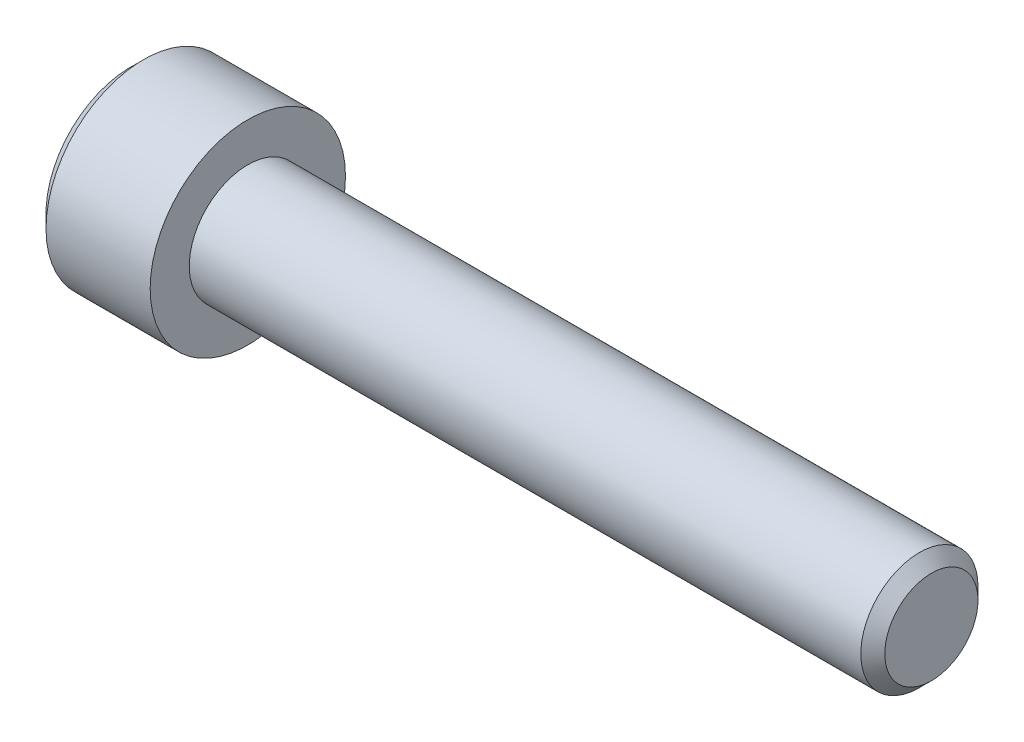
ISO-10303-21;
HEADER;
FILE_DESCRIPTION(('STEP AP214'),'2;1');
FILE_NAME('part.step','',(''),(''),'','','');
FILE_SCHEMA(('AUTOMOTIVE_DESIGN { 1 0 10303 214 1 1 1 1 }'));
ENDSEC;
DATA;
#1=APPLICATION_CONTEXT('core data for automotive mechanical design processes');
#2=APPLICATION_PROTOCOL_DEFINITION('international standard','automotive_design',2000,#1);
#3=PRODUCT_CONTEXT('',#1,'mechanical');
#4=PRODUCT('Part','Part','',(#3));
#5=PRODUCT_RELATED_PRODUCT_CATEGORY('part','',(#4));
#6=PRODUCT_DEFINITION_FORMATION('','',#4);
#7=PRODUCT_DEFINITION_CONTEXT('part definition',#1,'design');
#8=PRODUCT_DEFINITION('design','',#6,#7);
#9=PRODUCT_DEFINITION_SHAPE('','',#8);
#10=(LENGTH_UNIT() NAMED_UNIT(*) SI_UNIT(.MILLI.,.METRE.));
#11=(NAMED_UNIT(*) PLANE_ANGLE_UNIT() SI_UNIT($,.RADIAN.));
#12=(NAMED_UNIT(*) SI_UNIT($,.STERADIAN.) SOLID_ANGLE_UNIT());
#13=UNCERTAINTY_MEASURE_WITH_UNIT(LENGTH_MEASURE(1.E-05),#10,'distance_accuracy_value','');
#14=(GEOMETRIC_REPRESENTATION_CONTEXT(3) GLOBAL_UNCERTAINTY_ASSIGNED_CONTEXT((#13)) GLOBAL_UNIT_ASSIGNED_CONTEXT((#10,
#11,#12)) REPRESENTATION_CONTEXT('',''));
#15=CARTESIAN_POINT('',(0.,0.,0.));
#16=DIRECTION('',(0.,0.,1.));
#17=DIRECTION('',(1.,0.,0.));
#18=AXIS2_PLACEMENT_3D('',#15,#16,#17);
#19=CARTESIAN_POINT('',(-6.,0.,0.));
#20=DIRECTION('',(1.,0.,0.));
#21=DIRECTION('',(0.,0.,-1.));
#22=AXIS2_PLACEMENT_3D('',#19,#20,#21);
#23=PLANE('',#22);
#24=CARTESIAN_POINT('',(-6.,0.,0.));
#25=DIRECTION('',(1.,0.,0.));
#26=DIRECTION('',(0.,0.,-1.));
#27=AXIS2_PLACEMENT_3D('',#24,#25,#26);
#28=CIRCLE('',#27,4.3333333333333);
#29=CARTESIAN_POINT('',(-6.,0.,-4.3333333333333));
#30=VERTEX_POINT('',#29);
#31=EDGE_CURVE('E115',#30,#30,#28,.T.);
#32=ORIENTED_EDGE('',*,*,#31,.F.);
#33=EDGE_LOOP('',(#32));
#34=FACE_BOUND('',#33,.T.);
#35=DIRECTION('',(0.,0.499999999999983,-0.866025403784448));
#36=VECTOR('',#35,1.);
#37=CARTESIAN_POINT('',(-6.,-2.8867513459481,0.));
#38=LINE('',#37,#36);
#39=CARTESIAN_POINT('',(-6.,-2.8867513459481,0.));
#40=VERTEX_POINT('',#39);
#41=CARTESIAN_POINT('',(-6.,-1.4433756729741,-2.5));
#42=VERTEX_POINT('',#41);
#43=EDGE_CURVE('E100',#40,#42,#38,.T.);
#44=ORIENTED_EDGE('',*,*,#43,.T.);
#45=DIRECTION('',(0.,1.,0.));
#46=VECTOR('',#45,1.);
#47=CARTESIAN_POINT('',(-6.,-1.4433756729741,-2.5));
#48=LINE('',#47,#46);
#49=CARTESIAN_POINT('',(-6.,1.4433756729741,-2.5));
#50=VERTEX_POINT('',#49);
#51=EDGE_CURVE('E88',#42,#50,#48,.T.);
#52=ORIENTED_EDGE('',*,*,#51,.T.);
#53=DIRECTION('',(0.,0.499999999999983,0.866025403784448));
#54=VECTOR('',#53,1.);
#55=CARTESIAN_POINT('',(-6.,1.4433756729741,-2.5));
#56=LINE('',#55,#54);
#57=CARTESIAN_POINT('',(-6.,2.8867513459481,0.));
#58=VERTEX_POINT('',#57);
#59=EDGE_CURVE('E99',#50,#58,#56,.T.);
#60=ORIENTED_EDGE('',*,*,#59,.T.);
#61=DIRECTION('',(0.,-0.499999999999983,0.866025403784448));
#62=VECTOR('',#61,1.);
#63=CARTESIAN_POINT('',(-6.,2.8867513459481,0.));
#64=LINE('',#63,#62);
#65=CARTESIAN_POINT('',(-6.,1.4433756729741,2.5));
#66=VERTEX_POINT('',#65);
#67=EDGE_CURVE('E125',#58,#66,#64,.T.);
#68=ORIENTED_EDGE('',*,*,#67,.T.);
#69=DIRECTION('',(0.,-1.,0.));
#70=VECTOR('',#69,1.);
#71=CARTESIAN_POINT('',(-6.,1.4433756729741,2.5));
#72=LINE('',#71,#70);
#73=CARTESIAN_POINT('',(-6.,-1.4433756729741,2.5));
#74=VERTEX_POINT('',#73);
#75=EDGE_CURVE('E130',#66,#74,#72,.T.);
#76=ORIENTED_EDGE('',*,*,#75,.T.);
#77=DIRECTION('',(0.,-0.499999999999983,-0.866025403784448));
#78=VECTOR('',#77,1.);
#79=CARTESIAN_POINT('',(-6.,-1.4433756729741,2.5));
#80=LINE('',#79,#78);
#81=EDGE_CURVE('E114',#74,#40,#80,.T.);
#82=ORIENTED_EDGE('',*,*,#81,.T.);
#83=EDGE_LOOP('',(#44,#52,#60,#68,#76,#82));
#84=FACE_BOUND('',#83,.T.);
#85=ADVANCED_FACE('F16',(#34,#84),#23,.F.);
#86=CARTESIAN_POINT('',(-6.,0.,0.));
#87=DIRECTION('',(1.,0.,0.));
#88=DIRECTION('',(0.,0.,-1.));
#89=AXIS2_PLACEMENT_3D('',#86,#87,#88);
#90=CONICAL_SURFACE('',#89,4.3333333333333,0.78539816339745);
#91=CARTESIAN_POINT('',(-5.3333333333333,0.,0.));
#92=DIRECTION('',(1.,0.,0.));
#93=DIRECTION('',(0.,0.,-1.));
#94=AXIS2_PLACEMENT_3D('',#91,#92,#93);
#95=CIRCLE('',#94,5.);
#96=CARTESIAN_POINT('',(-5.3333333333333,0.,-5.));
#97=VERTEX_POINT('',#96);
#98=EDGE_CURVE('E137',#97,#97,#95,.T.);
#99=ORIENTED_EDGE('',*,*,#98,.F.);
#100=EDGE_LOOP('',(#99));
#101=FACE_BOUND('',#100,.T.);
#102=ORIENTED_EDGE('',*,*,#31,.T.);
#103=EDGE_LOOP('',(#102));
#104=FACE_BOUND('',#103,.T.);
#105=ADVANCED_FACE('F279',(#101,#104),#90,.T.);
#106=CARTESIAN_POINT('',(-3.,-2.8867513459481,0.));
#107=DIRECTION('',(0.,0.866025403784449,0.499999999999983));
#108=DIRECTION('',(0.,-0.499999999999983,0.866025403784449));
#109=AXIS2_PLACEMENT_3D('',#106,#107,#108);
#110=PLANE('',#109);
#111=ORIENTED_EDGE('',*,*,#43,.F.);
#112=DIRECTION('',(-1.,0.,0.));
#113=VECTOR('',#112,1.);
#114=CARTESIAN_POINT('',(-3.,-2.8867513459481,0.));
#115=LINE('',#114,#113);
#116=CARTESIAN_POINT('',(-3.,-2.8867513459481,0.));
#117=VERTEX_POINT('',#116);
#118=EDGE_CURVE('E142',#117,#40,#115,.T.);
#119=ORIENTED_EDGE('',*,*,#118,.F.);
#120=DIRECTION('',(0.,0.499999999999983,-0.866025403784448));
#121=VECTOR('',#120,1.);
#122=CARTESIAN_POINT('',(-3.,-2.8867513459481,0.));
#123=LINE('',#122,#121);
#124=CARTESIAN_POINT('',(-3.,-2.16506350946112,-1.24999999999996));
#125=VERTEX_POINT('',#124);
#126=EDGE_CURVE('E144',#117,#125,#123,.T.);
#127=ORIENTED_EDGE('',*,*,#126,.T.);
#128=DIRECTION('',(0.,0.499999999999983,-0.866025403784448));
#129=VECTOR('',#128,1.);
#130=CARTESIAN_POINT('',(-3.,-2.16506350946112,-1.24999999999996));
#131=LINE('',#130,#129);
#132=CARTESIAN_POINT('',(-3.,-1.4433756729741,-2.5));
#133=VERTEX_POINT('',#132);
#134=EDGE_CURVE('E109',#125,#133,#131,.T.);
#135=ORIENTED_EDGE('',*,*,#134,.T.);
#136=DIRECTION('',(-1.,0.,0.));
#137=VECTOR('',#136,1.);
#138=CARTESIAN_POINT('',(-3.,-1.4433756729741,-2.5));
#139=LINE('',#138,#137);
#140=EDGE_CURVE('E92',#133,#42,#139,.T.);
#141=ORIENTED_EDGE('',*,*,#140,.T.);
#142=EDGE_LOOP('',(#111,#119,#127,#135,#141));
#143=FACE_BOUND('',#142,.T.);
#144=ADVANCED_FACE('F105',(#143),#110,.T.);
#145=CARTESIAN_POINT('',(-3.,-1.4433756729741,-2.5));
#146=DIRECTION('',(0.,0.,1.));
#147=DIRECTION('',(1.,0.,0.));
#148=AXIS2_PLACEMENT_3D('',#145,#146,#147);
#149=PLANE('',#148);
#150=ORIENTED_EDGE('',*,*,#51,.F.);
#151=ORIENTED_EDGE('',*,*,#140,.F.);
#152=DIRECTION('',(0.,1.,0.));
#153=VECTOR('',#152,1.);
#154=CARTESIAN_POINT('',(-3.,-1.4433756729741,-2.5));
#155=LINE('',#154,#153);
#156=CARTESIAN_POINT('',(-3.,0.,-2.5));
#157=VERTEX_POINT('',#156);
#158=EDGE_CURVE('E110',#133,#157,#155,.T.);
#159=ORIENTED_EDGE('',*,*,#158,.T.);
#160=DIRECTION('',(0.,1.,0.));
#161=VECTOR('',#160,1.);
#162=CARTESIAN_POINT('',(-3.,0.,-2.5));
#163=LINE('',#162,#161);
#164=CARTESIAN_POINT('',(-3.,1.4433756729741,-2.5));
#165=VERTEX_POINT('',#164);
#166=EDGE_CURVE('E156',#157,#165,#163,.T.);
#167=ORIENTED_EDGE('',*,*,#166,.T.);
#168=DIRECTION('',(-1.,0.,0.));
#169=VECTOR('',#168,1.);
#170=CARTESIAN_POINT('',(-3.,1.4433756729741,-2.5));
#171=LINE('',#170,#169);
#172=EDGE_CURVE('E95',#165,#50,#171,.T.);
#173=ORIENTED_EDGE('',*,*,#172,.T.);
#174=EDGE_LOOP('',(#150,#151,#159,#167,#173));
#175=FACE_BOUND('',#174,.T.);
#176=ADVANCED_FACE('F90',(#175),#149,.T.);
#177=CARTESIAN_POINT('',(-3.,1.4433756729741,-2.5));
#178=DIRECTION('',(0.,-0.866025403784449,0.499999999999983));
#179=DIRECTION('',(0.,-0.499999999999983,-0.866025403784449));
#180=AXIS2_PLACEMENT_3D('',#177,#178,#179);
#181=PLANE('',#180);
#182=ORIENTED_EDGE('',*,*,#59,.F.);
#183=ORIENTED_EDGE('',*,*,#172,.F.);
#184=DIRECTION('',(0.,0.499999999999983,0.866025403784448));
#185=VECTOR('',#184,1.);
#186=CARTESIAN_POINT('',(-3.,1.4433756729741,-2.5));
#187=LINE('',#186,#185);
#188=CARTESIAN_POINT('',(-3.,2.16506350946112,-1.24999999999996));
#189=VERTEX_POINT('',#188);
#190=EDGE_CURVE('E163',#165,#189,#187,.T.);
#191=ORIENTED_EDGE('',*,*,#190,.T.);
#192=DIRECTION('',(0.,0.499999999999983,0.866025403784448));
#193=VECTOR('',#192,1.);
#194=CARTESIAN_POINT('',(-3.,2.16506350946112,-1.24999999999996));
#195=LINE('',#194,#193);
#196=CARTESIAN_POINT('',(-3.,2.8867513459481,0.));
#197=VERTEX_POINT('',#196);
#198=EDGE_CURVE('E168',#189,#197,#195,.T.);
#199=ORIENTED_EDGE('',*,*,#198,.T.);
#200=DIRECTION('',(-1.,0.,0.));
#201=VECTOR('',#200,1.);
#202=CARTESIAN_POINT('',(-3.,2.8867513459481,0.));
#203=LINE('',#202,#201);
#204=EDGE_CURVE('E173',#197,#58,#203,.T.);
#205=ORIENTED_EDGE('',*,*,#204,.T.);
#206=EDGE_LOOP('',(#182,#183,#191,#199,#205));
#207=FACE_BOUND('',#206,.T.);
#208=ADVANCED_FACE('F295',(#207),#181,.T.);
#209=CARTESIAN_POINT('',(-3.,2.8867513459481,0.));
#210=DIRECTION('',(0.,-0.866025403784449,-0.499999999999983));
#211=DIRECTION('',(0.,0.499999999999983,-0.866025403784449));
#212=AXIS2_PLACEMENT_3D('',#209,#210,#211);
#213=PLANE('',#212);
#214=ORIENTED_EDGE('',*,*,#67,.F.);
#215=ORIENTED_EDGE('',*,*,#204,.F.);
#216=DIRECTION('',(0.,-0.499999999999983,0.866025403784448));
#217=VECTOR('',#216,1.);
#218=CARTESIAN_POINT('',(-3.,2.8867513459481,0.));
#219=LINE('',#218,#217);
#220=CARTESIAN_POINT('',(-3.,2.16506350946112,1.24999999999996));
#221=VERTEX_POINT('',#220);
#222=EDGE_CURVE('E178',#197,#221,#219,.T.);
#223=ORIENTED_EDGE('',*,*,#222,.T.);
#224=DIRECTION('',(0.,-0.499999999999983,0.866025403784448));
#225=VECTOR('',#224,1.);
#226=CARTESIAN_POINT('',(-3.,2.16506350946112,1.24999999999996));
#227=LINE('',#226,#225);
#228=CARTESIAN_POINT('',(-3.,1.4433756729741,2.5));
#229=VERTEX_POINT('',#228);
#230=EDGE_CURVE('E183',#221,#229,#227,.T.);
#231=ORIENTED_EDGE('',*,*,#230,.T.);
#232=DIRECTION('',(-1.,0.,0.));
#233=VECTOR('',#232,1.);
#234=CARTESIAN_POINT('',(-3.,1.4433756729741,2.5));
#235=LINE('',#234,#233);
#236=EDGE_CURVE('E188',#229,#66,#235,.T.);
#237=ORIENTED_EDGE('',*,*,#236,.T.);
#238=EDGE_LOOP('',(#214,#215,#223,#231,#237));
#239=FACE_BOUND('',#238,.T.);
#240=ADVANCED_FACE('F298',(#239),#213,.T.);
#241=CARTESIAN_POINT('',(-3.,1.4433756729741,2.5));
#242=DIRECTION('',(0.,0.,-1.));
#243=DIRECTION('',(-1.,0.,0.));
#244=AXIS2_PLACEMENT_3D('',#241,#242,#243);
#245=PLANE('',#244);
#246=ORIENTED_EDGE('',*,*,#75,.F.);
#247=ORIENTED_EDGE('',*,*,#236,.F.);
#248=DIRECTION('',(0.,-1.,0.));
#249=VECTOR('',#248,1.);
#250=CARTESIAN_POINT('',(-3.,1.4433756729741,2.5));
#251=LINE('',#250,#249);
#252=CARTESIAN_POINT('',(-3.,0.,2.5));
#253=VERTEX_POINT('',#252);
#254=EDGE_CURVE('E193',#229,#253,#251,.T.);
#255=ORIENTED_EDGE('',*,*,#254,.T.);
#256=DIRECTION('',(0.,-1.,0.));
#257=VECTOR('',#256,1.);
#258=CARTESIAN_POINT('',(-3.,0.,2.5));
#259=LINE('',#258,#257);
#260=CARTESIAN_POINT('',(-3.,-1.4433756729741,2.5));
#261=VERTEX_POINT('',#260);
#262=EDGE_CURVE('E198',#253,#261,#259,.T.);
#263=ORIENTED_EDGE('',*,*,#262,.T.);
#264=DIRECTION('',(-1.,0.,0.));
#265=VECTOR('',#264,1.);
#266=CARTESIAN_POINT('',(-3.,-1.4433756729741,2.5));
#267=LINE('',#266,#265);
#268=EDGE_CURVE('E203',#261,#74,#267,.T.);
#269=ORIENTED_EDGE('',*,*,#268,.T.);
#270=EDGE_LOOP('',(#246,#247,#255,#263,#269));
#271=FACE_BOUND('',#270,.T.);
#272=ADVANCED_FACE('F302',(#271),#245,.T.);
#273=CARTESIAN_POINT('',(-3.,-1.4433756729741,2.5));
#274=DIRECTION('',(0.,0.866025403784449,-0.499999999999983));
#275=DIRECTION('',(0.,0.499999999999983,0.866025403784449));
#276=AXIS2_PLACEMENT_3D('',#273,#274,#275);
#277=PLANE('',#276);
#278=ORIENTED_EDGE('',*,*,#81,.F.);
#279=ORIENTED_EDGE('',*,*,#268,.F.);
#280=DIRECTION('',(0.,-0.499999999999983,-0.866025403784448));
#281=VECTOR('',#280,1.);
#282=CARTESIAN_POINT('',(-3.,-1.4433756729741,2.5));
#283=LINE('',#282,#281);
#284=CARTESIAN_POINT('',(-3.,-2.16506350946112,1.24999999999996));
#285=VERTEX_POINT('',#284);
#286=EDGE_CURVE('E208',#261,#285,#283,.T.);
#287=ORIENTED_EDGE('',*,*,#286,.T.);
#288=DIRECTION('',(0.,-0.499999999999983,-0.866025403784448));
#289=VECTOR('',#288,1.);
#290=CARTESIAN_POINT('',(-3.,-2.16506350946112,1.24999999999996));
#291=LINE('',#290,#289);
#292=EDGE_CURVE('E213',#285,#117,#291,.T.);
#293=ORIENTED_EDGE('',*,*,#292,.T.);
#294=ORIENTED_EDGE('',*,*,#118,.T.);
#295=EDGE_LOOP('',(#278,#279,#287,#293,#294));
#296=FACE_BOUND('',#295,.T.);
#297=ADVANCED_FACE('F275',(#296),#277,.T.);
#298=CARTESIAN_POINT('',(35.,0.,0.));
#299=DIRECTION('',(1.,0.,0.));
#300=DIRECTION('',(0.,0.,-1.));
#301=AXIS2_PLACEMENT_3D('',#298,#299,#300);
#302=CYLINDRICAL_SURFACE('',#301,5.);
#303=CARTESIAN_POINT('',(0.,0.,0.));
#304=DIRECTION('',(1.,0.,0.));
#305=DIRECTION('',(0.,0.,-1.));
#306=AXIS2_PLACEMENT_3D('',#303,#304,#305);
#307=CIRCLE('',#306,5.);
#308=CARTESIAN_POINT('',(0.,0.,-5.));
#309=VERTEX_POINT('',#308);
#310=EDGE_CURVE('E218',#309,#309,#307,.T.);
#311=ORIENTED_EDGE('',*,*,#310,.F.);
#312=EDGE_LOOP('',(#311));
#313=FACE_BOUND('',#312,.T.);
#314=ORIENTED_EDGE('',*,*,#98,.T.);
#315=EDGE_LOOP('',(#314));
#316=FACE_BOUND('',#315,.T.);
#317=ADVANCED_FACE('F271',(#313,#316),#302,.T.);
#318=CARTESIAN_POINT('',(-3.,0.,0.));
#319=DIRECTION('',(1.,0.,0.));
#320=DIRECTION('',(0.,0.,-1.));
#321=AXIS2_PLACEMENT_3D('',#318,#319,#320);
#322=PLANE('',#321);
#323=CARTESIAN_POINT('',(-3.,0.,0.));
#324=DIRECTION('',(1.,0.,0.));
#325=DIRECTION('',(0.,-0.866025403784448,0.499999999999984));
#326=AXIS2_PLACEMENT_3D('',#323,#324,#325);
#327=CIRCLE('',#326,2.5);
#328=EDGE_CURVE('E34',#285,#125,#327,.T.);
#329=ORIENTED_EDGE('',*,*,#328,.T.);
#330=ORIENTED_EDGE('',*,*,#126,.F.);
#331=ORIENTED_EDGE('',*,*,#292,.F.);
#332=EDGE_LOOP('',(#329,#330,#331));
#333=FACE_BOUND('',#332,.T.);
#334=ADVANCED_FACE('F274',(#333),#322,.F.);
#335=CARTESIAN_POINT('',(-3.,0.,0.));
#336=DIRECTION('',(1.,0.,0.));
#337=DIRECTION('',(0.,-0.866025403784448,-0.499999999999983));
#338=AXIS2_PLACEMENT_3D('',#335,#336,#337);
#339=CIRCLE('',#338,2.5);
#340=EDGE_CURVE('E224',#125,#157,#339,.T.);
#341=ORIENTED_EDGE('',*,*,#340,.T.);
#342=ORIENTED_EDGE('',*,*,#158,.F.);
#343=ORIENTED_EDGE('',*,*,#134,.F.);
#344=EDGE_LOOP('',(#341,#342,#343));
#345=FACE_BOUND('',#344,.T.);
#346=ADVANCED_FACE('F311',(#345),#322,.F.);
#347=CARTESIAN_POINT('',(-3.,0.,0.));
#348=DIRECTION('',(1.,0.,0.));
#349=DIRECTION('',(0.,0.,-1.));
#350=AXIS2_PLACEMENT_3D('',#347,#348,#349);
#351=CIRCLE('',#350,2.5);
#352=EDGE_CURVE('E229',#157,#189,#351,.T.);
#353=ORIENTED_EDGE('',*,*,#352,.T.);
#354=ORIENTED_EDGE('',*,*,#190,.F.);
#355=ORIENTED_EDGE('',*,*,#166,.F.);
#356=EDGE_LOOP('',(#353,#354,#355));
#357=FACE_BOUND('',#356,.T.);
#358=ADVANCED_FACE('F379',(#357),#322,.F.);
#359=CARTESIAN_POINT('',(-3.,0.,0.));
#360=DIRECTION('',(1.,0.,0.));
#361=DIRECTION('',(0.,0.866025403784448,-0.499999999999983));
#362=AXIS2_PLACEMENT_3D('',#359,#360,#361);
#363=CIRCLE('',#362,2.5);
#364=EDGE_CURVE('E234',#189,#221,#363,.T.);
#365=ORIENTED_EDGE('',*,*,#364,.T.);
#366=ORIENTED_EDGE('',*,*,#222,.F.);
#367=ORIENTED_EDGE('',*,*,#198,.F.);
#368=EDGE_LOOP('',(#365,#366,#367));
#369=FACE_BOUND('',#368,.T.);
#370=ADVANCED_FACE('F370',(#369),#322,.F.);
#371=CARTESIAN_POINT('',(-3.,0.,0.));
#372=DIRECTION('',(1.,0.,0.));
#373=DIRECTION('',(0.,0.866025403784448,0.499999999999983));
#374=AXIS2_PLACEMENT_3D('',#371,#372,#373);
#375=CIRCLE('',#374,2.5);
#376=EDGE_CURVE('E239',#221,#253,#375,.T.);
#377=ORIENTED_EDGE('',*,*,#376,.T.);
#378=ORIENTED_EDGE('',*,*,#254,.F.);
#379=ORIENTED_EDGE('',*,*,#230,.F.);
#380=EDGE_LOOP('',(#377,#378,#379));
#381=FACE_BOUND('',#380,.T.);
#382=ADVANCED_FACE('F361',(#381),#322,.F.);
#383=CARTESIAN_POINT('',(-3.,0.,0.));
#384=DIRECTION('',(1.,0.,0.));
#385=DIRECTION('',(0.,0.,1.));
#386=AXIS2_PLACEMENT_3D('',#383,#384,#385);
#387=CIRCLE('',#386,2.5);
#388=EDGE_CURVE('E244',#253,#285,#387,.T.);
#389=ORIENTED_EDGE('',*,*,#388,.T.);
#390=ORIENTED_EDGE('',*,*,#286,.F.);
#391=ORIENTED_EDGE('',*,*,#262,.F.);
#392=EDGE_LOOP('',(#389,#390,#391));
#393=FACE_BOUND('',#392,.T.);
#394=ADVANCED_FACE('F267',(#393),#322,.F.);
#395=CARTESIAN_POINT('',(0.,5.,0.));
#396=DIRECTION('',(-1.,0.,0.));
#397=DIRECTION('',(0.,0.,1.));
#398=AXIS2_PLACEMENT_3D('',#395,#396,#397);
#399=PLANE('',#398);
#400=CARTESIAN_POINT('',(0.,0.,0.));
#401=DIRECTION('',(1.,0.,0.));
#402=DIRECTION('',(0.,0.,-1.));
#403=AXIS2_PLACEMENT_3D('',#400,#401,#402);
#404=CIRCLE('',#403,3.);
#405=CARTESIAN_POINT('',(0.,0.,-3.));
#406=VERTEX_POINT('',#405);
#407=EDGE_CURVE('E248',#406,#406,#404,.T.);
#408=ORIENTED_EDGE('',*,*,#407,.F.);
#409=EDGE_LOOP('',(#408));
#410=FACE_BOUND('',#409,.T.);
#411=ORIENTED_EDGE('',*,*,#310,.T.);
#412=EDGE_LOOP('',(#411));
#413=FACE_BOUND('',#412,.T.);
#414=ADVANCED_FACE('F264',(#410,#413),#399,.F.);
#415=CARTESIAN_POINT('',(-3.,0.,0.));
#416=DIRECTION('',(-1.,0.,0.));
#417=DIRECTION('',(0.,0.,1.));
#418=AXIS2_PLACEMENT_3D('',#415,#416,#417);
#419=CONICAL_SURFACE('',#418,2.5,1.30899693899575);
#420=CARTESIAN_POINT('',(-2.3301270189222,0.,0.));
#421=VERTEX_POINT('',#420);
#422=VERTEX_LOOP('',#421);
#423=FACE_BOUND('',#422,.T.);
#424=ORIENTED_EDGE('',*,*,#352,.F.);
#425=ORIENTED_EDGE('',*,*,#340,.F.);
#426=ORIENTED_EDGE('',*,*,#328,.F.);
#427=ORIENTED_EDGE('',*,*,#388,.F.);
#428=ORIENTED_EDGE('',*,*,#376,.F.);
#429=ORIENTED_EDGE('',*,*,#364,.F.);
#430=EDGE_LOOP('',(#424,#425,#426,#427,#428,#429));
#431=FACE_BOUND('',#430,.T.);
#432=ADVANCED_FACE('F260',(#423,#431),#419,.F.);
#433=CARTESIAN_POINT('',(35.,0.,0.));
#434=DIRECTION('',(1.,0.,0.));
#435=DIRECTION('',(0.,0.,-1.));
#436=AXIS2_PLACEMENT_3D('',#433,#434,#435);
#437=CYLINDRICAL_SURFACE('',#436,3.);
#438=CARTESIAN_POINT('',(34.3865,0.,0.));
#439=DIRECTION('',(1.,0.,0.));
#440=DIRECTION('',(0.,0.,-1.));
#441=AXIS2_PLACEMENT_3D('',#438,#439,#440);
#442=CIRCLE('',#441,3.);
#443=CARTESIAN_POINT('',(34.3865,0.,-3.));
#444=VERTEX_POINT('',#443);
#445=EDGE_CURVE('E24',#444,#444,#442,.T.);
#446=ORIENTED_EDGE('',*,*,#445,.F.);
#447=EDGE_LOOP('',(#446));
#448=FACE_BOUND('',#447,.T.);
#449=ORIENTED_EDGE('',*,*,#407,.T.);
#450=EDGE_LOOP('',(#449));
#451=FACE_BOUND('',#450,.T.);
#452=ADVANCED_FACE('F257',(#448,#451),#437,.T.);
#453=CARTESIAN_POINT('',(34.3865,0.,0.));
#454=DIRECTION('',(-1.,0.,0.));
#455=DIRECTION('',(0.,0.,1.));
#456=AXIS2_PLACEMENT_3D('',#453,#454,#455);
#457=CONICAL_SURFACE('',#456,3.,0.785398163397446);
#458=CARTESIAN_POINT('',(35.,0.,0.));
#459=DIRECTION('',(1.,0.,0.));
#460=DIRECTION('',(0.,0.,-1.));
#461=AXIS2_PLACEMENT_3D('',#458,#459,#460);
#462=CIRCLE('',#461,2.3865);
#463=CARTESIAN_POINT('',(35.,0.,-2.3865));
#464=VERTEX_POINT('',#463);
#465=EDGE_CURVE('E11',#464,#464,#462,.T.);
#466=ORIENTED_EDGE('',*,*,#465,.F.);
#467=EDGE_LOOP('',(#466));
#468=FACE_BOUND('',#467,.T.);
#469=ORIENTED_EDGE('',*,*,#445,.T.);
#470=EDGE_LOOP('',(#469));
#471=FACE_BOUND('',#470,.T.);
#472=ADVANCED_FACE('F255',(#468,#471),#457,.T.);
#473=CARTESIAN_POINT('',(35.,2.3865,0.));
#474=DIRECTION('',(-1.,0.,0.));
#475=DIRECTION('',(0.,0.,1.));
#476=AXIS2_PLACEMENT_3D('',#473,#474,#475);
#477=PLANE('',#476);
#478=ORIENTED_EDGE('',*,*,#465,.T.);
#479=EDGE_LOOP('',(#478));
#480=FACE_BOUND('',#479,.T.);
#481=ADVANCED_FACE('F18',(#480),#477,.F.);
#482=CLOSED_SHELL('',(#85,#105,#144,#176,#208,#240,#272,#297,#317,#334,#346,#358,#370,#382,#394,
#414,#432,#452,#472,#481));
#483=MANIFOLD_SOLID_BREP('B1',#482);
#484=ADVANCED_BREP_SHAPE_REPRESENTATION('',(#18,#483),#14);
#485=SHAPE_DEFINITION_REPRESENTATION(#9,#484);
ENDSEC;
END-ISO-10303-21;
